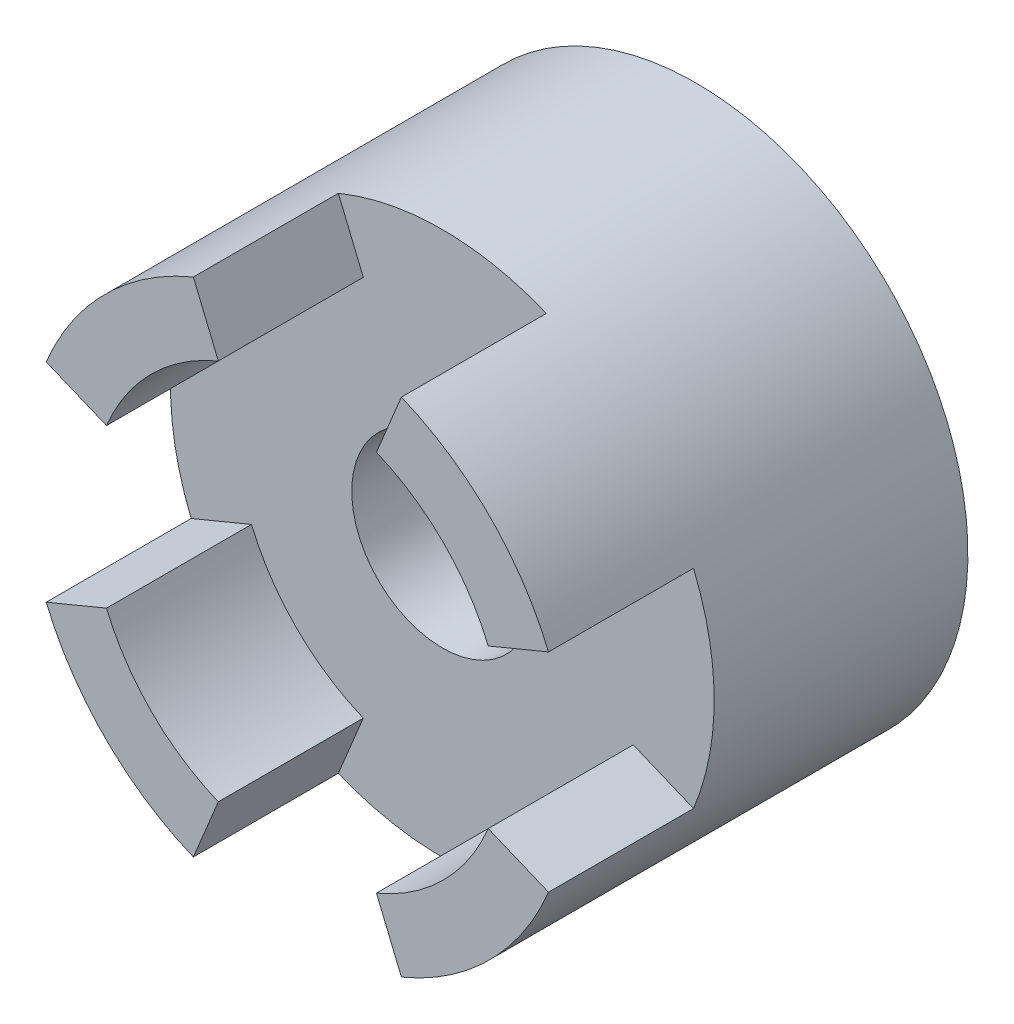
ISO-10303-21;
HEADER;
FILE_DESCRIPTION(('STEP AP214'),'2;1');
FILE_NAME('part.step','',(''),(''),'','','');
FILE_SCHEMA(('AUTOMOTIVE_DESIGN { 1 0 10303 214 1 1 1 1 }'));
ENDSEC;
DATA;
#1=APPLICATION_CONTEXT('core data for automotive mechanical design processes');
#2=APPLICATION_PROTOCOL_DEFINITION('international standard','automotive_design',2000,#1);
#3=PRODUCT_CONTEXT('',#1,'mechanical');
#4=PRODUCT('Part','Part','',(#3));
#5=PRODUCT_RELATED_PRODUCT_CATEGORY('part','',(#4));
#6=PRODUCT_DEFINITION_FORMATION('','',#4);
#7=PRODUCT_DEFINITION_CONTEXT('part definition',#1,'design');
#8=PRODUCT_DEFINITION('design','',#6,#7);
#9=PRODUCT_DEFINITION_SHAPE('','',#8);
#10=(LENGTH_UNIT() NAMED_UNIT(*) SI_UNIT(.MILLI.,.METRE.));
#11=(NAMED_UNIT(*) PLANE_ANGLE_UNIT() SI_UNIT($,.RADIAN.));
#12=(NAMED_UNIT(*) SI_UNIT($,.STERADIAN.) SOLID_ANGLE_UNIT());
#13=UNCERTAINTY_MEASURE_WITH_UNIT(LENGTH_MEASURE(1.E-05),#10,'distance_accuracy_value','');
#14=(GEOMETRIC_REPRESENTATION_CONTEXT(3) GLOBAL_UNCERTAINTY_ASSIGNED_CONTEXT((#13)) GLOBAL_UNIT_ASSIGNED_CONTEXT((#10,
#11,#12)) REPRESENTATION_CONTEXT('',''));
#15=CARTESIAN_POINT('',(0.,0.,0.));
#16=DIRECTION('',(0.,0.,1.));
#17=DIRECTION('',(1.,0.,0.));
#18=AXIS2_PLACEMENT_3D('',#15,#16,#17);
#19=CARTESIAN_POINT('',(0.,0.,-38.1));
#20=DIRECTION('',(0.,0.,1.));
#21=DIRECTION('',(1.,0.,0.));
#22=AXIS2_PLACEMENT_3D('',#19,#20,#21);
#23=CYLINDRICAL_SURFACE('',#22,19.05);
#24=DIRECTION('',(0.,0.,1.));
#25=VECTOR('',#24,1.);
#26=CARTESIAN_POINT('',(-7.29011938655499,17.59990509434,-10.16));
#27=LINE('',#26,#25);
#28=CARTESIAN_POINT('',(-7.29011938655499,17.59990509434,-10.16));
#29=VERTEX_POINT('',#28);
#30=CARTESIAN_POINT('',(-7.29011938655499,17.59990509434,0.));
#31=VERTEX_POINT('',#30);
#32=EDGE_CURVE('E225',#29,#31,#27,.T.);
#33=ORIENTED_EDGE('',*,*,#32,.F.);
#34=CARTESIAN_POINT('',(0.,0.,-10.16));
#35=DIRECTION('',(0.,0.,1.));
#36=DIRECTION('',(-1.,0.,0.));
#37=AXIS2_PLACEMENT_3D('',#34,#35,#36);
#38=CIRCLE('',#37,19.05);
#39=CARTESIAN_POINT('',(7.29011938655499,17.59990509434,-10.16));
#40=VERTEX_POINT('',#39);
#41=EDGE_CURVE('E183',#40,#29,#38,.T.);
#42=ORIENTED_EDGE('',*,*,#41,.F.);
#43=DIRECTION('',(0.,0.,1.));
#44=VECTOR('',#43,1.);
#45=CARTESIAN_POINT('',(7.29011938655499,17.59990509434,-10.16));
#46=LINE('',#45,#44);
#47=CARTESIAN_POINT('',(7.29011938655499,17.59990509434,0.));
#48=VERTEX_POINT('',#47);
#49=EDGE_CURVE('E179',#40,#48,#46,.T.);
#50=ORIENTED_EDGE('',*,*,#49,.T.);
#51=CARTESIAN_POINT('',(0.,0.,0.));
#52=DIRECTION('',(0.,0.,1.));
#53=DIRECTION('',(1.,0.,0.));
#54=AXIS2_PLACEMENT_3D('',#51,#52,#53);
#55=CIRCLE('',#54,19.05);
#56=CARTESIAN_POINT('',(17.59990509434,7.29011938655493,0.));
#57=VERTEX_POINT('',#56);
#58=EDGE_CURVE('E12',#57,#48,#55,.T.);
#59=ORIENTED_EDGE('',*,*,#58,.F.);
#60=DIRECTION('',(0.,0.,1.));
#61=VECTOR('',#60,1.);
#62=CARTESIAN_POINT('',(17.59990509434,7.29011938655493,-10.16));
#63=LINE('',#62,#61);
#64=CARTESIAN_POINT('',(17.59990509434,7.29011938655493,-10.16));
#65=VERTEX_POINT('',#64);
#66=EDGE_CURVE('E295',#65,#57,#63,.T.);
#67=ORIENTED_EDGE('',*,*,#66,.F.);
#68=CARTESIAN_POINT('',(0.,0.,-10.16));
#69=DIRECTION('',(0.,0.,1.));
#70=DIRECTION('',(-1.,0.,0.));
#71=AXIS2_PLACEMENT_3D('',#68,#69,#70);
#72=CIRCLE('',#71,19.05);
#73=CARTESIAN_POINT('',(17.59990509434,-7.29011938655505,-10.16));
#74=VERTEX_POINT('',#73);
#75=EDGE_CURVE('E310',#74,#65,#72,.T.);
#76=ORIENTED_EDGE('',*,*,#75,.F.);
#77=DIRECTION('',(0.,0.,1.));
#78=VECTOR('',#77,1.);
#79=CARTESIAN_POINT('',(17.59990509434,-7.29011938655505,-10.16));
#80=LINE('',#79,#78);
#81=CARTESIAN_POINT('',(17.59990509434,-7.29011938655505,0.));
#82=VERTEX_POINT('',#81);
#83=EDGE_CURVE('E291',#74,#82,#80,.T.);
#84=ORIENTED_EDGE('',*,*,#83,.T.);
#85=CARTESIAN_POINT('',(7.29011938655487,-17.5999050943401,0.));
#86=VERTEX_POINT('',#85);
#87=EDGE_CURVE('E68',#86,#82,#55,.T.);
#88=ORIENTED_EDGE('',*,*,#87,.F.);
#89=DIRECTION('',(0.,0.,1.));
#90=VECTOR('',#89,1.);
#91=CARTESIAN_POINT('',(7.29011938655487,-17.5999050943401,-10.16));
#92=LINE('',#91,#90);
#93=CARTESIAN_POINT('',(7.29011938655487,-17.5999050943401,-10.16));
#94=VERTEX_POINT('',#93);
#95=EDGE_CURVE('E266',#94,#86,#92,.T.);
#96=ORIENTED_EDGE('',*,*,#95,.F.);
#97=CARTESIAN_POINT('',(0.,0.,-10.16));
#98=DIRECTION('',(0.,0.,1.));
#99=DIRECTION('',(-1.,0.,0.));
#100=AXIS2_PLACEMENT_3D('',#97,#98,#99);
#101=CIRCLE('',#100,19.05);
#102=CARTESIAN_POINT('',(-7.29011938655511,-17.59990509434,-10.16));
#103=VERTEX_POINT('',#102);
#104=EDGE_CURVE('E282',#103,#94,#101,.T.);
#105=ORIENTED_EDGE('',*,*,#104,.F.);
#106=DIRECTION('',(0.,0.,1.));
#107=VECTOR('',#106,1.);
#108=CARTESIAN_POINT('',(-7.29011938655511,-17.59990509434,-10.16));
#109=LINE('',#108,#107);
#110=CARTESIAN_POINT('',(-7.29011938655511,-17.59990509434,0.));
#111=VERTEX_POINT('',#110);
#112=EDGE_CURVE('E262',#103,#111,#109,.T.);
#113=ORIENTED_EDGE('',*,*,#112,.T.);
#114=CARTESIAN_POINT('',(-17.5999050943401,-7.29011938655481,0.));
#115=VERTEX_POINT('',#114);
#116=EDGE_CURVE('E419',#115,#111,#55,.T.);
#117=ORIENTED_EDGE('',*,*,#116,.F.);
#118=DIRECTION('',(0.,0.,1.));
#119=VECTOR('',#118,1.);
#120=CARTESIAN_POINT('',(-17.5999050943401,-7.29011938655481,-10.16));
#121=LINE('',#120,#119);
#122=CARTESIAN_POINT('',(-17.5999050943401,-7.29011938655481,-10.16));
#123=VERTEX_POINT('',#122);
#124=EDGE_CURVE('E235',#123,#115,#121,.T.);
#125=ORIENTED_EDGE('',*,*,#124,.F.);
#126=CARTESIAN_POINT('',(0.,0.,-10.16));
#127=DIRECTION('',(0.,0.,1.));
#128=DIRECTION('',(-1.,0.,0.));
#129=AXIS2_PLACEMENT_3D('',#126,#127,#128);
#130=CIRCLE('',#129,19.05);
#131=CARTESIAN_POINT('',(-17.5999050943399,7.29011938655517,-10.16));
#132=VERTEX_POINT('',#131);
#133=EDGE_CURVE('E253',#132,#123,#130,.T.);
#134=ORIENTED_EDGE('',*,*,#133,.F.);
#135=DIRECTION('',(0.,0.,1.));
#136=VECTOR('',#135,1.);
#137=CARTESIAN_POINT('',(-17.5999050943399,7.29011938655517,-10.16));
#138=LINE('',#137,#136);
#139=CARTESIAN_POINT('',(-17.5999050943399,7.29011938655517,0.));
#140=VERTEX_POINT('',#139);
#141=EDGE_CURVE('E231',#132,#140,#138,.T.);
#142=ORIENTED_EDGE('',*,*,#141,.T.);
#143=EDGE_CURVE('E67',#31,#140,#55,.T.);
#144=ORIENTED_EDGE('',*,*,#143,.F.);
#145=EDGE_LOOP('',(#33,#42,#50,#59,#67,#76,#84,#88,#96,#105,#113,#117,#125,#134,#142,#144));
#146=FACE_BOUND('',#145,.T.);
#147=CARTESIAN_POINT('',(0.,0.,-27.94));
#148=DIRECTION('',(0.,0.,-1.));
#149=DIRECTION('',(-1.,0.,0.));
#150=AXIS2_PLACEMENT_3D('',#147,#148,#149);
#151=CIRCLE('',#150,19.05);
#152=CARTESIAN_POINT('',(-19.05,0.,-27.94));
#153=VERTEX_POINT('',#152);
#154=EDGE_CURVE('E250',#153,#153,#151,.T.);
#155=ORIENTED_EDGE('',*,*,#154,.F.);
#156=EDGE_LOOP('',(#155));
#157=FACE_BOUND('',#156,.T.);
#158=ADVANCED_FACE('F58',(#146,#157),#23,.T.);
#159=CARTESIAN_POINT('',(0.,0.,-79.0499679120753));
#160=DIRECTION('',(0.,0.,1.));
#161=DIRECTION('',(1.,0.,0.));
#162=AXIS2_PLACEMENT_3D('',#159,#160,#161);
#163=CYLINDRICAL_SURFACE('',#162,6.35);
#164=CARTESIAN_POINT('',(0.,0.,-10.16));
#165=DIRECTION('',(0.,0.,1.));
#166=DIRECTION('',(1.,0.,0.));
#167=AXIS2_PLACEMENT_3D('',#164,#165,#166);
#168=CIRCLE('',#167,6.35);
#169=CARTESIAN_POINT('',(6.35,0.,-10.16));
#170=VERTEX_POINT('',#169);
#171=EDGE_CURVE('E214',#170,#170,#168,.T.);
#172=ORIENTED_EDGE('',*,*,#171,.T.);
#173=EDGE_LOOP('',(#172));
#174=FACE_BOUND('',#173,.T.);
#175=CARTESIAN_POINT('',(0.,0.,-27.94));
#176=DIRECTION('',(0.,0.,-1.));
#177=DIRECTION('',(-1.,0.,0.));
#178=AXIS2_PLACEMENT_3D('',#175,#176,#177);
#179=CIRCLE('',#178,6.35);
#180=CARTESIAN_POINT('',(-6.35,0.,-27.94));
#181=VERTEX_POINT('',#180);
#182=EDGE_CURVE('E330',#181,#181,#179,.T.);
#183=ORIENTED_EDGE('',*,*,#182,.T.);
#184=EDGE_LOOP('',(#183));
#185=FACE_BOUND('',#184,.T.);
#186=ADVANCED_FACE('F335',(#174,#185),#163,.F.);
#187=CARTESIAN_POINT('',(0.,0.,0.));
#188=DIRECTION('',(0.,0.,1.));
#189=DIRECTION('',(1.,0.,0.));
#190=AXIS2_PLACEMENT_3D('',#187,#188,#189);
#191=PLANE('',#190);
#192=DIRECTION('',(0.382683432365091,-0.923879532511286,0.));
#193=VECTOR('',#192,1.);
#194=CARTESIAN_POINT('',(-5.54049073378179,13.3759278716984,0.));
#195=LINE('',#194,#193);
#196=CARTESIAN_POINT('',(-5.54049073378179,13.3759278716984,0.));
#197=VERTEX_POINT('',#196);
#198=EDGE_CURVE('E184',#31,#197,#195,.T.);
#199=ORIENTED_EDGE('',*,*,#198,.F.);
#200=ORIENTED_EDGE('',*,*,#143,.T.);
#201=DIRECTION('',(-0.92387953251128,0.382683432365105,0.));
#202=VECTOR('',#201,1.);
#203=CARTESIAN_POINT('',(-13.3759278716983,5.54049073378191,0.));
#204=LINE('',#203,#202);
#205=CARTESIAN_POINT('',(-13.3759278716983,5.54049073378191,0.));
#206=VERTEX_POINT('',#205);
#207=EDGE_CURVE('E247',#206,#140,#204,.T.);
#208=ORIENTED_EDGE('',*,*,#207,.F.);
#209=CARTESIAN_POINT('',(0.,0.,0.));
#210=DIRECTION('',(0.,0.,1.));
#211=DIRECTION('',(1.,0.,0.));
#212=AXIS2_PLACEMENT_3D('',#209,#210,#211);
#213=CIRCLE('',#212,14.478);
#214=EDGE_CURVE('E405',#197,#206,#213,.T.);
#215=ORIENTED_EDGE('',*,*,#214,.F.);
#216=EDGE_LOOP('',(#199,#200,#208,#215));
#217=FACE_BOUND('',#216,.T.);
#218=ADVANCED_FACE('F349',(#217),#191,.T.);
#219=DIRECTION('',(0.382683432365095,0.923879532511285,0.));
#220=VECTOR('',#219,1.);
#221=CARTESIAN_POINT('',(5.54049073378177,13.3759278716984,0.));
#222=LINE('',#221,#220);
#223=CARTESIAN_POINT('',(5.54049073378177,13.3759278716984,0.));
#224=VERTEX_POINT('',#223);
#225=EDGE_CURVE('E301',#224,#48,#222,.T.);
#226=ORIENTED_EDGE('',*,*,#225,.F.);
#227=CARTESIAN_POINT('',(13.3759278716984,5.54049073378174,0.));
#228=VERTEX_POINT('',#227);
#229=EDGE_CURVE('E193',#228,#224,#213,.T.);
#230=ORIENTED_EDGE('',*,*,#229,.F.);
#231=DIRECTION('',(-0.923879532511288,-0.382683432365088,0.));
#232=VECTOR('',#231,1.);
#233=CARTESIAN_POINT('',(13.3759278716984,5.54049073378174,0.));
#234=LINE('',#233,#232);
#235=EDGE_CURVE('E302',#57,#228,#234,.T.);
#236=ORIENTED_EDGE('',*,*,#235,.F.);
#237=ORIENTED_EDGE('',*,*,#58,.T.);
#238=EDGE_LOOP('',(#226,#230,#236,#237));
#239=FACE_BOUND('',#238,.T.);
#240=ADVANCED_FACE('F439',(#239),#191,.T.);
#241=DIRECTION('',(0.923879532511283,-0.382683432365098,0.));
#242=VECTOR('',#241,1.);
#243=CARTESIAN_POINT('',(13.3759278716984,-5.54049073378182,0.));
#244=LINE('',#243,#242);
#245=CARTESIAN_POINT('',(13.3759278716984,-5.54049073378182,0.));
#246=VERTEX_POINT('',#245);
#247=EDGE_CURVE('E273',#246,#82,#244,.T.);
#248=ORIENTED_EDGE('',*,*,#247,.F.);
#249=CARTESIAN_POINT('',(5.5404907337817,-13.3759278716984,0.));
#250=VERTEX_POINT('',#249);
#251=EDGE_CURVE('E202',#250,#246,#213,.T.);
#252=ORIENTED_EDGE('',*,*,#251,.F.);
#253=DIRECTION('',(-0.382683432365085,0.923879532511289,0.));
#254=VECTOR('',#253,1.);
#255=CARTESIAN_POINT('',(5.5404907337817,-13.3759278716984,0.));
#256=LINE('',#255,#254);
#257=EDGE_CURVE('E274',#86,#250,#256,.T.);
#258=ORIENTED_EDGE('',*,*,#257,.F.);
#259=ORIENTED_EDGE('',*,*,#87,.T.);
#260=EDGE_LOOP('',(#248,#252,#258,#259));
#261=FACE_BOUND('',#260,.T.);
#262=ADVANCED_FACE('F358',(#261),#191,.T.);
#263=CARTESIAN_POINT('',(0.,0.,-38.1));
#264=DIRECTION('',(0.,0.,1.));
#265=DIRECTION('',(1.,0.,0.));
#266=AXIS2_PLACEMENT_3D('',#263,#264,#265);
#267=CYLINDRICAL_SURFACE('',#266,14.478);
#268=CARTESIAN_POINT('',(0.,0.,-10.16));
#269=DIRECTION('',(0.,0.,1.));
#270=DIRECTION('',(1.,0.,0.));
#271=AXIS2_PLACEMENT_3D('',#268,#269,#270);
#272=CIRCLE('',#271,14.478);
#273=CARTESIAN_POINT('',(-5.54049073378179,13.3759278716984,-10.16));
#274=VERTEX_POINT('',#273);
#275=CARTESIAN_POINT('',(-13.3759278716983,5.54049073378191,-10.16));
#276=VERTEX_POINT('',#275);
#277=EDGE_CURVE('E203',#274,#276,#272,.T.);
#278=ORIENTED_EDGE('',*,*,#277,.F.);
#279=DIRECTION('',(0.,0.,1.));
#280=VECTOR('',#279,1.);
#281=CARTESIAN_POINT('',(-5.54049073378179,13.3759278716984,-10.16));
#282=LINE('',#281,#280);
#283=EDGE_CURVE('E220',#274,#197,#282,.T.);
#284=ORIENTED_EDGE('',*,*,#283,.T.);
#285=ORIENTED_EDGE('',*,*,#214,.T.);
#286=DIRECTION('',(0.,0.,1.));
#287=VECTOR('',#286,1.);
#288=CARTESIAN_POINT('',(-13.3759278716983,5.54049073378191,-10.16));
#289=LINE('',#288,#287);
#290=EDGE_CURVE('E228',#276,#206,#289,.T.);
#291=ORIENTED_EDGE('',*,*,#290,.F.);
#292=EDGE_LOOP('',(#278,#284,#285,#291));
#293=FACE_BOUND('',#292,.T.);
#294=ADVANCED_FACE('F403',(#293),#267,.F.);
#295=ORIENTED_EDGE('',*,*,#229,.T.);
#296=DIRECTION('',(0.,0.,1.));
#297=VECTOR('',#296,1.);
#298=CARTESIAN_POINT('',(5.54049073378177,13.3759278716984,-10.16));
#299=LINE('',#298,#297);
#300=CARTESIAN_POINT('',(5.54049073378177,13.3759278716984,-10.16));
#301=VERTEX_POINT('',#300);
#302=EDGE_CURVE('E176',#301,#224,#299,.T.);
#303=ORIENTED_EDGE('',*,*,#302,.F.);
#304=CARTESIAN_POINT('',(13.3759278716984,5.54049073378175,-10.16));
#305=VERTEX_POINT('',#304);
#306=EDGE_CURVE('E191',#305,#301,#272,.T.);
#307=ORIENTED_EDGE('',*,*,#306,.F.);
#308=DIRECTION('',(0.,0.,1.));
#309=VECTOR('',#308,1.);
#310=CARTESIAN_POINT('',(13.3759278716984,5.54049073378174,-10.16));
#311=LINE('',#310,#309);
#312=EDGE_CURVE('E298',#305,#228,#311,.T.);
#313=ORIENTED_EDGE('',*,*,#312,.T.);
#314=EDGE_LOOP('',(#295,#303,#307,#313));
#315=FACE_BOUND('',#314,.T.);
#316=ADVANCED_FACE('F189',(#315),#267,.F.);
#317=ORIENTED_EDGE('',*,*,#251,.T.);
#318=DIRECTION('',(0.,0.,1.));
#319=VECTOR('',#318,1.);
#320=CARTESIAN_POINT('',(13.3759278716984,-5.54049073378182,-10.16));
#321=LINE('',#320,#319);
#322=CARTESIAN_POINT('',(13.3759278716984,-5.54049073378182,-10.16));
#323=VERTEX_POINT('',#322);
#324=EDGE_CURVE('E288',#323,#246,#321,.T.);
#325=ORIENTED_EDGE('',*,*,#324,.F.);
#326=CARTESIAN_POINT('',(5.5404907337817,-13.3759278716984,-10.16));
#327=VERTEX_POINT('',#326);
#328=EDGE_CURVE('E205',#327,#323,#272,.T.);
#329=ORIENTED_EDGE('',*,*,#328,.F.);
#330=DIRECTION('',(0.,0.,1.));
#331=VECTOR('',#330,1.);
#332=CARTESIAN_POINT('',(5.5404907337817,-13.3759278716984,-10.16));
#333=LINE('',#332,#331);
#334=EDGE_CURVE('E269',#327,#250,#333,.T.);
#335=ORIENTED_EDGE('',*,*,#334,.T.);
#336=EDGE_LOOP('',(#317,#325,#329,#335));
#337=FACE_BOUND('',#336,.T.);
#338=ADVANCED_FACE('F356',(#337),#267,.F.);
#339=DIRECTION('',(-0.382683432365102,-0.923879532511282,0.));
#340=VECTOR('',#339,1.);
#341=CARTESIAN_POINT('',(-5.54049073378187,-13.3759278716984,0.));
#342=LINE('',#341,#340);
#343=CARTESIAN_POINT('',(-5.54049073378187,-13.3759278716984,0.));
#344=VERTEX_POINT('',#343);
#345=EDGE_CURVE('E242',#344,#111,#342,.T.);
#346=ORIENTED_EDGE('',*,*,#345,.F.);
#347=CARTESIAN_POINT('',(-13.3759278716985,-5.54049073378165,0.));
#348=VERTEX_POINT('',#347);
#349=EDGE_CURVE('E209',#348,#344,#213,.T.);
#350=ORIENTED_EDGE('',*,*,#349,.F.);
#351=DIRECTION('',(0.92387953251129,0.382683432365081,0.));
#352=VECTOR('',#351,1.);
#353=CARTESIAN_POINT('',(-13.3759278716985,-5.54049073378165,0.));
#354=LINE('',#353,#352);
#355=EDGE_CURVE('E243',#115,#348,#354,.T.);
#356=ORIENTED_EDGE('',*,*,#355,.F.);
#357=ORIENTED_EDGE('',*,*,#116,.T.);
#358=EDGE_LOOP('',(#346,#350,#356,#357));
#359=FACE_BOUND('',#358,.T.);
#360=ADVANCED_FACE('F353',(#359),#191,.T.);
#361=ORIENTED_EDGE('',*,*,#349,.T.);
#362=DIRECTION('',(0.,0.,1.));
#363=VECTOR('',#362,1.);
#364=CARTESIAN_POINT('',(-5.54049073378187,-13.3759278716984,-10.16));
#365=LINE('',#364,#363);
#366=CARTESIAN_POINT('',(-5.54049073378187,-13.3759278716984,-10.16));
#367=VERTEX_POINT('',#366);
#368=EDGE_CURVE('E259',#367,#344,#365,.T.);
#369=ORIENTED_EDGE('',*,*,#368,.F.);
#370=CARTESIAN_POINT('',(-13.3759278716985,-5.54049073378165,-10.16));
#371=VERTEX_POINT('',#370);
#372=EDGE_CURVE('E211',#371,#367,#272,.T.);
#373=ORIENTED_EDGE('',*,*,#372,.F.);
#374=DIRECTION('',(0.,0.,1.));
#375=VECTOR('',#374,1.);
#376=CARTESIAN_POINT('',(-13.3759278716985,-5.54049073378165,-10.16));
#377=LINE('',#376,#375);
#378=EDGE_CURVE('E238',#371,#348,#377,.T.);
#379=ORIENTED_EDGE('',*,*,#378,.T.);
#380=EDGE_LOOP('',(#361,#369,#373,#379));
#381=FACE_BOUND('',#380,.T.);
#382=ADVANCED_FACE('F60',(#381),#267,.F.);
#383=CARTESIAN_POINT('',(0.,0.,-10.16));
#384=DIRECTION('',(0.,0.,1.));
#385=DIRECTION('',(1.,0.,0.));
#386=AXIS2_PLACEMENT_3D('',#383,#384,#385);
#387=PLANE('',#386);
#388=ORIENTED_EDGE('',*,*,#171,.F.);
#389=EDGE_LOOP('',(#388));
#390=FACE_BOUND('',#389,.T.);
#391=ORIENTED_EDGE('',*,*,#306,.T.);
#392=DIRECTION('',(0.382683432365095,0.923879532511285,0.));
#393=VECTOR('',#392,1.);
#394=CARTESIAN_POINT('',(5.54049073378177,13.3759278716984,-10.16));
#395=LINE('',#394,#393);
#396=EDGE_CURVE('E173',#301,#40,#395,.T.);
#397=ORIENTED_EDGE('',*,*,#396,.T.);
#398=ORIENTED_EDGE('',*,*,#41,.T.);
#399=DIRECTION('',(0.382683432365091,-0.923879532511286,0.));
#400=VECTOR('',#399,1.);
#401=CARTESIAN_POINT('',(-5.54049073378179,13.3759278716984,-10.16));
#402=LINE('',#401,#400);
#403=EDGE_CURVE('E195',#29,#274,#402,.T.);
#404=ORIENTED_EDGE('',*,*,#403,.T.);
#405=ORIENTED_EDGE('',*,*,#277,.T.);
#406=DIRECTION('',(-0.92387953251128,0.382683432365105,0.));
#407=VECTOR('',#406,1.);
#408=CARTESIAN_POINT('',(-13.3759278716983,5.54049073378191,-10.16));
#409=LINE('',#408,#407);
#410=EDGE_CURVE('E246',#276,#132,#409,.T.);
#411=ORIENTED_EDGE('',*,*,#410,.T.);
#412=ORIENTED_EDGE('',*,*,#133,.T.);
#413=DIRECTION('',(0.92387953251129,0.382683432365081,0.));
#414=VECTOR('',#413,1.);
#415=CARTESIAN_POINT('',(-13.3759278716985,-5.54049073378165,-10.16));
#416=LINE('',#415,#414);
#417=EDGE_CURVE('E82',#123,#371,#416,.T.);
#418=ORIENTED_EDGE('',*,*,#417,.T.);
#419=ORIENTED_EDGE('',*,*,#372,.T.);
#420=DIRECTION('',(-0.382683432365102,-0.923879532511282,0.));
#421=VECTOR('',#420,1.);
#422=CARTESIAN_POINT('',(-5.54049073378187,-13.3759278716984,-10.16));
#423=LINE('',#422,#421);
#424=EDGE_CURVE('E277',#367,#103,#423,.T.);
#425=ORIENTED_EDGE('',*,*,#424,.T.);
#426=ORIENTED_EDGE('',*,*,#104,.T.);
#427=DIRECTION('',(-0.382683432365085,0.923879532511289,0.));
#428=VECTOR('',#427,1.);
#429=CARTESIAN_POINT('',(5.5404907337817,-13.3759278716984,-10.16));
#430=LINE('',#429,#428);
#431=EDGE_CURVE('E75',#94,#327,#430,.T.);
#432=ORIENTED_EDGE('',*,*,#431,.T.);
#433=ORIENTED_EDGE('',*,*,#328,.T.);
#434=DIRECTION('',(0.923879532511283,-0.382683432365098,0.));
#435=VECTOR('',#434,1.);
#436=CARTESIAN_POINT('',(13.3759278716984,-5.54049073378182,-10.16));
#437=LINE('',#436,#435);
#438=EDGE_CURVE('E305',#323,#74,#437,.T.);
#439=ORIENTED_EDGE('',*,*,#438,.T.);
#440=ORIENTED_EDGE('',*,*,#75,.T.);
#441=DIRECTION('',(-0.923879532511288,-0.382683432365088,0.));
#442=VECTOR('',#441,1.);
#443=CARTESIAN_POINT('',(13.3759278716984,5.54049073378174,-10.16));
#444=LINE('',#443,#442);
#445=EDGE_CURVE('E199',#65,#305,#444,.T.);
#446=ORIENTED_EDGE('',*,*,#445,.T.);
#447=EDGE_LOOP('',(#391,#397,#398,#404,#405,#411,#412,#418,#419,#425,#426,#432,#433,#439,#440,#446));
#448=FACE_BOUND('',#447,.T.);
#449=ADVANCED_FACE('F197',(#390,#448),#387,.T.);
#450=CARTESIAN_POINT('',(-13.3759278716985,-5.54049073378165,-10.16));
#451=DIRECTION('',(0.382683432365081,-0.92387953251129,0.));
#452=DIRECTION('',(0.92387953251129,0.382683432365081,0.));
#453=AXIS2_PLACEMENT_3D('',#450,#451,#452);
#454=PLANE('',#453);
#455=ORIENTED_EDGE('',*,*,#355,.T.);
#456=ORIENTED_EDGE('',*,*,#378,.F.);
#457=ORIENTED_EDGE('',*,*,#417,.F.);
#458=ORIENTED_EDGE('',*,*,#124,.T.);
#459=EDGE_LOOP('',(#455,#456,#457,#458));
#460=FACE_BOUND('',#459,.T.);
#461=ADVANCED_FACE('F360',(#460),#454,.F.);
#462=CARTESIAN_POINT('',(-13.3759278716983,5.54049073378191,-10.16));
#463=DIRECTION('',(0.382683432365105,0.923879532511281,0.));
#464=DIRECTION('',(-0.923879532511281,0.382683432365105,0.));
#465=AXIS2_PLACEMENT_3D('',#462,#463,#464);
#466=PLANE('',#465);
#467=ORIENTED_EDGE('',*,*,#207,.T.);
#468=ORIENTED_EDGE('',*,*,#141,.F.);
#469=ORIENTED_EDGE('',*,*,#410,.F.);
#470=ORIENTED_EDGE('',*,*,#290,.T.);
#471=EDGE_LOOP('',(#467,#468,#469,#470));
#472=FACE_BOUND('',#471,.T.);
#473=ADVANCED_FACE('F363',(#472),#466,.F.);
#474=CARTESIAN_POINT('',(5.5404907337817,-13.3759278716984,-10.16));
#475=DIRECTION('',(0.923879532511289,0.382683432365085,0.));
#476=DIRECTION('',(-0.382683432365085,0.923879532511289,0.));
#477=AXIS2_PLACEMENT_3D('',#474,#475,#476);
#478=PLANE('',#477);
#479=ORIENTED_EDGE('',*,*,#257,.T.);
#480=ORIENTED_EDGE('',*,*,#334,.F.);
#481=ORIENTED_EDGE('',*,*,#431,.F.);
#482=ORIENTED_EDGE('',*,*,#95,.T.);
#483=EDGE_LOOP('',(#479,#480,#481,#482));
#484=FACE_BOUND('',#483,.T.);
#485=ADVANCED_FACE('F366',(#484),#478,.F.);
#486=CARTESIAN_POINT('',(-5.54049073378187,-13.3759278716984,-10.16));
#487=DIRECTION('',(-0.923879532511282,0.382683432365102,0.));
#488=DIRECTION('',(-0.382683432365102,-0.923879532511282,0.));
#489=AXIS2_PLACEMENT_3D('',#486,#487,#488);
#490=PLANE('',#489);
#491=ORIENTED_EDGE('',*,*,#345,.T.);
#492=ORIENTED_EDGE('',*,*,#112,.F.);
#493=ORIENTED_EDGE('',*,*,#424,.F.);
#494=ORIENTED_EDGE('',*,*,#368,.T.);
#495=EDGE_LOOP('',(#491,#492,#493,#494));
#496=FACE_BOUND('',#495,.T.);
#497=ADVANCED_FACE('F371',(#496),#490,.F.);
#498=CARTESIAN_POINT('',(13.3759278716984,5.54049073378174,-10.16));
#499=DIRECTION('',(-0.382683432365088,0.923879532511287,0.));
#500=DIRECTION('',(-0.923879532511288,-0.382683432365088,0.));
#501=AXIS2_PLACEMENT_3D('',#498,#499,#500);
#502=PLANE('',#501);
#503=ORIENTED_EDGE('',*,*,#235,.T.);
#504=ORIENTED_EDGE('',*,*,#312,.F.);
#505=ORIENTED_EDGE('',*,*,#445,.F.);
#506=ORIENTED_EDGE('',*,*,#66,.T.);
#507=EDGE_LOOP('',(#503,#504,#505,#506));
#508=FACE_BOUND('',#507,.T.);
#509=ADVANCED_FACE('F374',(#508),#502,.F.);
#510=CARTESIAN_POINT('',(13.3759278716984,-5.54049073378182,-10.16));
#511=DIRECTION('',(-0.382683432365098,-0.923879532511283,0.));
#512=DIRECTION('',(0.923879532511283,-0.382683432365098,0.));
#513=AXIS2_PLACEMENT_3D('',#510,#511,#512);
#514=PLANE('',#513);
#515=ORIENTED_EDGE('',*,*,#247,.T.);
#516=ORIENTED_EDGE('',*,*,#83,.F.);
#517=ORIENTED_EDGE('',*,*,#438,.F.);
#518=ORIENTED_EDGE('',*,*,#324,.T.);
#519=EDGE_LOOP('',(#515,#516,#517,#518));
#520=FACE_BOUND('',#519,.T.);
#521=ADVANCED_FACE('F379',(#520),#514,.F.);
#522=CARTESIAN_POINT('',(-5.54049073378179,13.3759278716984,-10.16));
#523=DIRECTION('',(-0.923879532511286,-0.382683432365091,0.));
#524=DIRECTION('',(0.382683432365091,-0.923879532511286,0.));
#525=AXIS2_PLACEMENT_3D('',#522,#523,#524);
#526=PLANE('',#525);
#527=ORIENTED_EDGE('',*,*,#198,.T.);
#528=ORIENTED_EDGE('',*,*,#283,.F.);
#529=ORIENTED_EDGE('',*,*,#403,.F.);
#530=ORIENTED_EDGE('',*,*,#32,.T.);
#531=EDGE_LOOP('',(#527,#528,#529,#530));
#532=FACE_BOUND('',#531,.T.);
#533=ADVANCED_FACE('F382',(#532),#526,.F.);
#534=CARTESIAN_POINT('',(5.54049073378177,13.3759278716984,-10.16));
#535=DIRECTION('',(0.923879532511285,-0.382683432365095,0.));
#536=DIRECTION('',(0.382683432365095,0.923879532511285,0.));
#537=AXIS2_PLACEMENT_3D('',#534,#535,#536);
#538=PLANE('',#537);
#539=ORIENTED_EDGE('',*,*,#225,.T.);
#540=ORIENTED_EDGE('',*,*,#49,.F.);
#541=ORIENTED_EDGE('',*,*,#396,.F.);
#542=ORIENTED_EDGE('',*,*,#302,.T.);
#543=EDGE_LOOP('',(#539,#540,#541,#542));
#544=FACE_BOUND('',#543,.T.);
#545=ADVANCED_FACE('F175',(#544),#538,.F.);
#546=CARTESIAN_POINT('',(0.,0.,-27.94));
#547=DIRECTION('',(0.,0.,-1.));
#548=DIRECTION('',(-1.,0.,0.));
#549=AXIS2_PLACEMENT_3D('',#546,#547,#548);
#550=PLANE('',#549);
#551=ORIENTED_EDGE('',*,*,#182,.F.);
#552=EDGE_LOOP('',(#551));
#553=FACE_BOUND('',#552,.T.);
#554=ORIENTED_EDGE('',*,*,#154,.T.);
#555=EDGE_LOOP('',(#554));
#556=FACE_BOUND('',#555,.T.);
#557=ADVANCED_FACE('F337',(#553,#556),#550,.T.);
#558=CLOSED_SHELL('',(#158,#186,#218,#240,#262,#294,#316,#338,#360,#382,#449,#461,#473,#485,
#497,#509,#521,#533,#545,#557));
#559=MANIFOLD_SOLID_BREP('B2',#558);
#560=ADVANCED_BREP_SHAPE_REPRESENTATION('',(#18,#559),#14);
#561=SHAPE_DEFINITION_REPRESENTATION(#9,#560);
ENDSEC;
END-ISO-10303-21;
